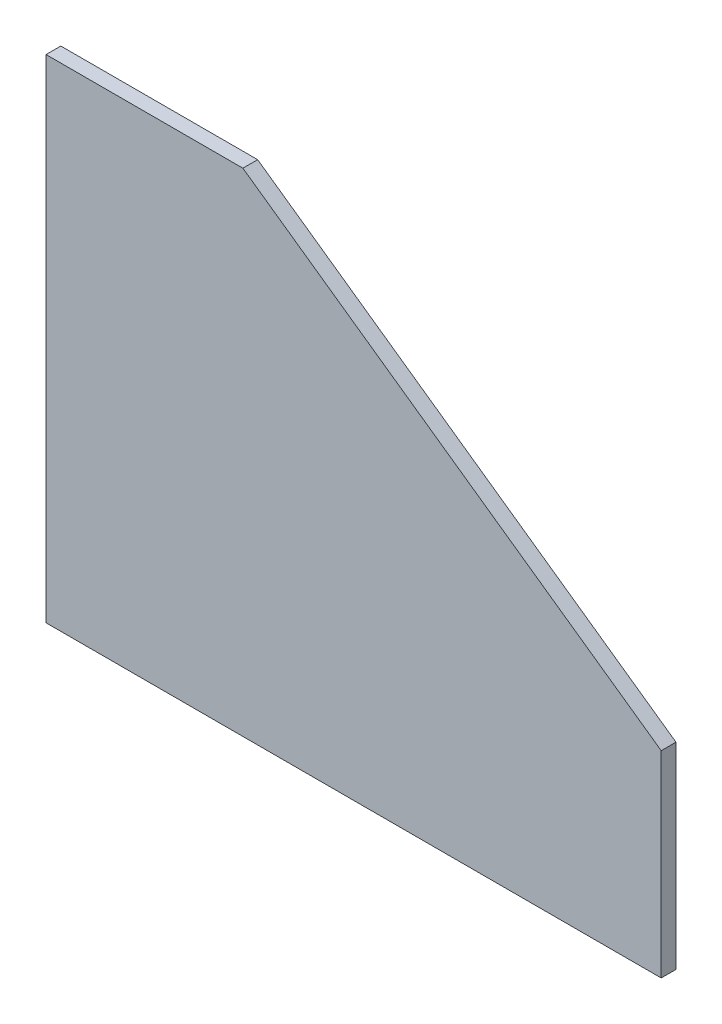
ISO-10303-21;
HEADER;
FILE_DESCRIPTION(('STEP AP214'),'2;1');
FILE_NAME('part.step','',(''),(''),'','','');
FILE_SCHEMA(('AUTOMOTIVE_DESIGN { 1 0 10303 214 1 1 1 1 }'));
ENDSEC;
DATA;
#1=APPLICATION_CONTEXT('core data for automotive mechanical design processes');
#2=APPLICATION_PROTOCOL_DEFINITION('international standard','automotive_design',2000,#1);
#3=PRODUCT_CONTEXT('',#1,'mechanical');
#4=PRODUCT('Part','Part','',(#3));
#5=PRODUCT_RELATED_PRODUCT_CATEGORY('part','',(#4));
#6=PRODUCT_DEFINITION_FORMATION('','',#4);
#7=PRODUCT_DEFINITION_CONTEXT('part definition',#1,'design');
#8=PRODUCT_DEFINITION('design','',#6,#7);
#9=PRODUCT_DEFINITION_SHAPE('','',#8);
#10=(LENGTH_UNIT() NAMED_UNIT(*) SI_UNIT(.MILLI.,.METRE.));
#11=(NAMED_UNIT(*) PLANE_ANGLE_UNIT() SI_UNIT($,.RADIAN.));
#12=(NAMED_UNIT(*) SI_UNIT($,.STERADIAN.) SOLID_ANGLE_UNIT());
#13=UNCERTAINTY_MEASURE_WITH_UNIT(LENGTH_MEASURE(1.E-05),#10,'distance_accuracy_value','');
#14=(GEOMETRIC_REPRESENTATION_CONTEXT(3) GLOBAL_UNCERTAINTY_ASSIGNED_CONTEXT((#13)) GLOBAL_UNIT_ASSIGNED_CONTEXT((#10,
#11,#12)) REPRESENTATION_CONTEXT('',''));
#15=CARTESIAN_POINT('',(0.,0.,0.));
#16=DIRECTION('',(0.,0.,1.));
#17=DIRECTION('',(1.,0.,0.));
#18=AXIS2_PLACEMENT_3D('',#15,#16,#17);
#19=CARTESIAN_POINT('',(0.,200.,6.));
#20=DIRECTION('',(1.,0.,0.));
#21=DIRECTION('',(0.,1.,0.));
#22=AXIS2_PLACEMENT_3D('',#19,#20,#21);
#23=PLANE('',#22);
#24=DIRECTION('',(0.,-1.,0.));
#25=VECTOR('',#24,1.);
#26=CARTESIAN_POINT('',(0.,200.,0.));
#27=LINE('',#26,#25);
#28=CARTESIAN_POINT('',(0.,200.,0.));
#29=VERTEX_POINT('',#28);
#30=CARTESIAN_POINT('',(0.,0.,0.));
#31=VERTEX_POINT('',#30);
#32=EDGE_CURVE('E111',#29,#31,#27,.T.);
#33=ORIENTED_EDGE('',*,*,#32,.T.);
#34=DIRECTION('',(0.,0.,-1.));
#35=VECTOR('',#34,1.);
#36=CARTESIAN_POINT('',(0.,0.,6.));
#37=LINE('',#36,#35);
#38=CARTESIAN_POINT('',(0.,0.,6.));
#39=VERTEX_POINT('',#38);
#40=EDGE_CURVE('E11',#39,#31,#37,.T.);
#41=ORIENTED_EDGE('',*,*,#40,.F.);
#42=DIRECTION('',(0.,-1.,0.));
#43=VECTOR('',#42,1.);
#44=CARTESIAN_POINT('',(0.,200.,6.));
#45=LINE('',#44,#43);
#46=CARTESIAN_POINT('',(0.,200.,6.));
#47=VERTEX_POINT('',#46);
#48=EDGE_CURVE('E119',#47,#39,#45,.T.);
#49=ORIENTED_EDGE('',*,*,#48,.F.);
#50=DIRECTION('',(0.,0.,-1.));
#51=VECTOR('',#50,1.);
#52=CARTESIAN_POINT('',(0.,200.,6.));
#53=LINE('',#52,#51);
#54=EDGE_CURVE('E107',#47,#29,#53,.T.);
#55=ORIENTED_EDGE('',*,*,#54,.T.);
#56=EDGE_LOOP('',(#33,#41,#49,#55));
#57=FACE_BOUND('',#56,.T.);
#58=ADVANCED_FACE('F37',(#57),#23,.F.);
#59=CARTESIAN_POINT('',(0.,0.,6.));
#60=DIRECTION('',(0.,1.,0.));
#61=DIRECTION('',(0.,0.,1.));
#62=AXIS2_PLACEMENT_3D('',#59,#60,#61);
#63=PLANE('',#62);
#64=DIRECTION('',(1.,0.,0.));
#65=VECTOR('',#64,1.);
#66=CARTESIAN_POINT('',(0.,0.,0.));
#67=LINE('',#66,#65);
#68=CARTESIAN_POINT('',(250.,0.,0.));
#69=VERTEX_POINT('',#68);
#70=EDGE_CURVE('E114',#31,#69,#67,.T.);
#71=ORIENTED_EDGE('',*,*,#70,.T.);
#72=DIRECTION('',(0.,0.,-1.));
#73=VECTOR('',#72,1.);
#74=CARTESIAN_POINT('',(250.,0.,6.));
#75=LINE('',#74,#73);
#76=CARTESIAN_POINT('',(250.,0.,6.));
#77=VERTEX_POINT('',#76);
#78=EDGE_CURVE('E45',#77,#69,#75,.T.);
#79=ORIENTED_EDGE('',*,*,#78,.F.);
#80=DIRECTION('',(1.,0.,0.));
#81=VECTOR('',#80,1.);
#82=CARTESIAN_POINT('',(0.,0.,6.));
#83=LINE('',#82,#81);
#84=EDGE_CURVE('E87',#39,#77,#83,.T.);
#85=ORIENTED_EDGE('',*,*,#84,.F.);
#86=ORIENTED_EDGE('',*,*,#40,.T.);
#87=EDGE_LOOP('',(#71,#79,#85,#86));
#88=FACE_BOUND('',#87,.T.);
#89=ADVANCED_FACE('F138',(#88),#63,.F.);
#90=CARTESIAN_POINT('',(250.,0.,6.));
#91=DIRECTION('',(-1.,0.,0.));
#92=DIRECTION('',(0.,0.,1.));
#93=AXIS2_PLACEMENT_3D('',#90,#91,#92);
#94=PLANE('',#93);
#95=DIRECTION('',(0.,1.,0.));
#96=VECTOR('',#95,1.);
#97=CARTESIAN_POINT('',(250.,0.,0.));
#98=LINE('',#97,#96);
#99=CARTESIAN_POINT('',(250.,80.,0.));
#100=VERTEX_POINT('',#99);
#101=EDGE_CURVE('E102',#69,#100,#98,.T.);
#102=ORIENTED_EDGE('',*,*,#101,.T.);
#103=DIRECTION('',(0.,0.,-1.));
#104=VECTOR('',#103,1.);
#105=CARTESIAN_POINT('',(250.,80.,6.));
#106=LINE('',#105,#104);
#107=CARTESIAN_POINT('',(250.,80.,6.));
#108=VERTEX_POINT('',#107);
#109=EDGE_CURVE('E99',#108,#100,#106,.T.);
#110=ORIENTED_EDGE('',*,*,#109,.F.);
#111=DIRECTION('',(0.,1.,0.));
#112=VECTOR('',#111,1.);
#113=CARTESIAN_POINT('',(250.,0.,6.));
#114=LINE('',#113,#112);
#115=EDGE_CURVE('E91',#77,#108,#114,.T.);
#116=ORIENTED_EDGE('',*,*,#115,.F.);
#117=ORIENTED_EDGE('',*,*,#78,.T.);
#118=EDGE_LOOP('',(#102,#110,#116,#117));
#119=FACE_BOUND('',#118,.T.);
#120=ADVANCED_FACE('F100',(#119),#94,.F.);
#121=CARTESIAN_POINT('',(250.,80.,6.));
#122=DIRECTION('',(-0.576683197598655,-0.816967863264762,0.));
#123=DIRECTION('',(0.816967863264762,-0.576683197598655,0.));
#124=AXIS2_PLACEMENT_3D('',#121,#122,#123);
#125=PLANE('',#124);
#126=DIRECTION('',(-0.816967863264762,0.576683197598655,0.));
#127=VECTOR('',#126,1.);
#128=CARTESIAN_POINT('',(250.,80.,0.));
#129=LINE('',#128,#127);
#130=CARTESIAN_POINT('',(80.,200.,0.));
#131=VERTEX_POINT('',#130);
#132=EDGE_CURVE('E73',#100,#131,#129,.T.);
#133=ORIENTED_EDGE('',*,*,#132,.T.);
#134=DIRECTION('',(0.,0.,-1.));
#135=VECTOR('',#134,1.);
#136=CARTESIAN_POINT('',(80.,200.,6.));
#137=LINE('',#136,#135);
#138=CARTESIAN_POINT('',(80.,200.,6.));
#139=VERTEX_POINT('',#138);
#140=EDGE_CURVE('E103',#139,#131,#137,.T.);
#141=ORIENTED_EDGE('',*,*,#140,.F.);
#142=DIRECTION('',(-0.816967863264762,0.576683197598655,0.));
#143=VECTOR('',#142,1.);
#144=CARTESIAN_POINT('',(250.,80.,6.));
#145=LINE('',#144,#143);
#146=EDGE_CURVE('E95',#108,#139,#145,.T.);
#147=ORIENTED_EDGE('',*,*,#146,.F.);
#148=ORIENTED_EDGE('',*,*,#109,.T.);
#149=EDGE_LOOP('',(#133,#141,#147,#148));
#150=FACE_BOUND('',#149,.T.);
#151=ADVANCED_FACE('F105',(#150),#125,.F.);
#152=CARTESIAN_POINT('',(80.,200.,6.));
#153=DIRECTION('',(0.,-1.,0.));
#154=DIRECTION('',(0.,0.,-1.));
#155=AXIS2_PLACEMENT_3D('',#152,#153,#154);
#156=PLANE('',#155);
#157=DIRECTION('',(-1.,0.,0.));
#158=VECTOR('',#157,1.);
#159=CARTESIAN_POINT('',(80.,200.,0.));
#160=LINE('',#159,#158);
#161=EDGE_CURVE('E79',#131,#29,#160,.T.);
#162=ORIENTED_EDGE('',*,*,#161,.T.);
#163=ORIENTED_EDGE('',*,*,#54,.F.);
#164=DIRECTION('',(-1.,0.,0.));
#165=VECTOR('',#164,1.);
#166=CARTESIAN_POINT('',(80.,200.,6.));
#167=LINE('',#166,#165);
#168=EDGE_CURVE('E53',#139,#47,#167,.T.);
#169=ORIENTED_EDGE('',*,*,#168,.F.);
#170=ORIENTED_EDGE('',*,*,#140,.T.);
#171=EDGE_LOOP('',(#162,#163,#169,#170));
#172=FACE_BOUND('',#171,.T.);
#173=ADVANCED_FACE('F127',(#172),#156,.F.);
#174=CARTESIAN_POINT('',(0.,0.,6.));
#175=DIRECTION('',(0.,0.,1.));
#176=DIRECTION('',(1.,0.,0.));
#177=AXIS2_PLACEMENT_3D('',#174,#175,#176);
#178=PLANE('',#177);
#179=ORIENTED_EDGE('',*,*,#48,.T.);
#180=ORIENTED_EDGE('',*,*,#84,.T.);
#181=ORIENTED_EDGE('',*,*,#115,.T.);
#182=ORIENTED_EDGE('',*,*,#146,.T.);
#183=ORIENTED_EDGE('',*,*,#168,.T.);
#184=EDGE_LOOP('',(#179,#180,#181,#182,#183));
#185=FACE_BOUND('',#184,.T.);
#186=ADVANCED_FACE('F93',(#185),#178,.T.);
#187=CARTESIAN_POINT('',(0.,0.,0.));
#188=DIRECTION('',(0.,0.,1.));
#189=DIRECTION('',(1.,0.,0.));
#190=AXIS2_PLACEMENT_3D('',#187,#188,#189);
#191=PLANE('',#190);
#192=ORIENTED_EDGE('',*,*,#32,.F.);
#193=ORIENTED_EDGE('',*,*,#161,.F.);
#194=ORIENTED_EDGE('',*,*,#132,.F.);
#195=ORIENTED_EDGE('',*,*,#101,.F.);
#196=ORIENTED_EDGE('',*,*,#70,.F.);
#197=EDGE_LOOP('',(#192,#193,#194,#195,#196));
#198=FACE_BOUND('',#197,.T.);
#199=ADVANCED_FACE('F123',(#198),#191,.F.);
#200=CLOSED_SHELL('',(#58,#89,#120,#151,#173,#186,#199));
#201=MANIFOLD_SOLID_BREP('B2',#200);
#202=ADVANCED_BREP_SHAPE_REPRESENTATION('',(#18,#201),#14);
#203=SHAPE_DEFINITION_REPRESENTATION(#9,#202);
ENDSEC;
END-ISO-10303-21;
